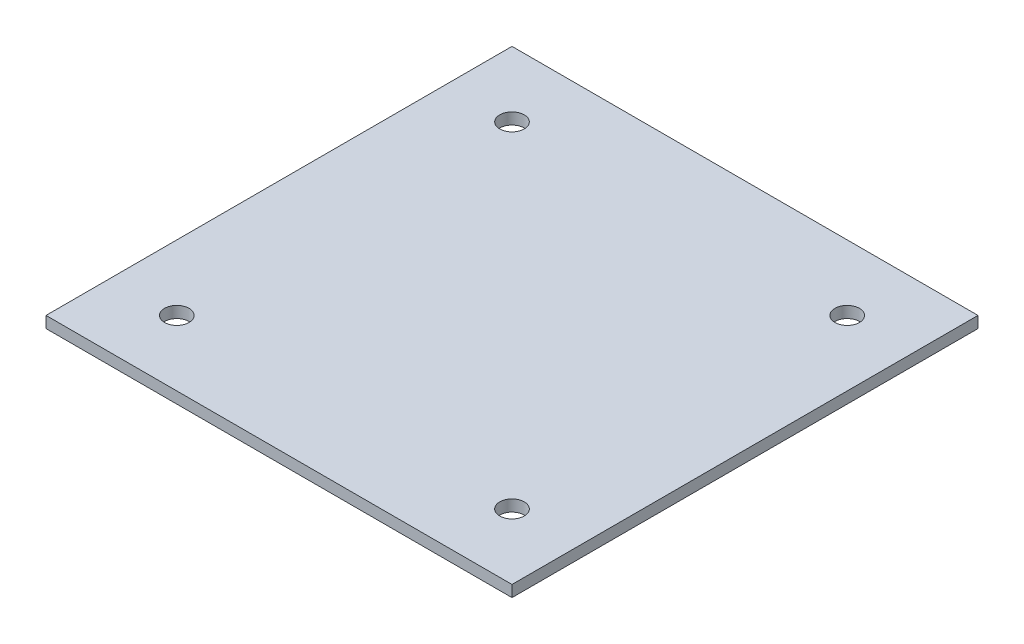
ISO-10303-21;
HEADER;
FILE_DESCRIPTION(('STEP AP214'),'2;1');
FILE_NAME('part.step','',(''),(''),'','','');
FILE_SCHEMA(('AUTOMOTIVE_DESIGN { 1 0 10303 214 1 1 1 1 }'));
ENDSEC;
DATA;
#1=APPLICATION_CONTEXT('core data for automotive mechanical design processes');
#2=APPLICATION_PROTOCOL_DEFINITION('international standard','automotive_design',2000,#1);
#3=PRODUCT_CONTEXT('',#1,'mechanical');
#4=PRODUCT('Part','Part','',(#3));
#5=PRODUCT_RELATED_PRODUCT_CATEGORY('part','',(#4));
#6=PRODUCT_DEFINITION_FORMATION('','',#4);
#7=PRODUCT_DEFINITION_CONTEXT('part definition',#1,'design');
#8=PRODUCT_DEFINITION('design','',#6,#7);
#9=PRODUCT_DEFINITION_SHAPE('','',#8);
#10=(LENGTH_UNIT() NAMED_UNIT(*) SI_UNIT(.MILLI.,.METRE.));
#11=(NAMED_UNIT(*) PLANE_ANGLE_UNIT() SI_UNIT($,.RADIAN.));
#12=(NAMED_UNIT(*) SI_UNIT($,.STERADIAN.) SOLID_ANGLE_UNIT());
#13=UNCERTAINTY_MEASURE_WITH_UNIT(LENGTH_MEASURE(1.E-05),#10,'distance_accuracy_value','');
#14=(GEOMETRIC_REPRESENTATION_CONTEXT(3) GLOBAL_UNCERTAINTY_ASSIGNED_CONTEXT((#13)) GLOBAL_UNIT_ASSIGNED_CONTEXT((#10,
#11,#12)) REPRESENTATION_CONTEXT('',''));
#15=CARTESIAN_POINT('',(0.,0.,0.));
#16=DIRECTION('',(0.,0.,1.));
#17=DIRECTION('',(1.,0.,0.));
#18=AXIS2_PLACEMENT_3D('',#15,#16,#17);
#19=CARTESIAN_POINT('',(0.,1.397,28.5));
#20=DIRECTION('',(0.,0.,-1.));
#21=DIRECTION('',(-1.,0.,0.));
#22=AXIS2_PLACEMENT_3D('',#19,#20,#21);
#23=PLANE('',#22);
#24=DIRECTION('',(1.,0.,0.));
#25=VECTOR('',#24,1.);
#26=CARTESIAN_POINT('',(0.,0.,28.5));
#27=LINE('',#26,#25);
#28=CARTESIAN_POINT('',(-28.5,0.,28.5));
#29=VERTEX_POINT('',#28);
#30=CARTESIAN_POINT('',(28.5,0.,28.5));
#31=VERTEX_POINT('',#30);
#32=EDGE_CURVE('E115',#29,#31,#27,.T.);
#33=ORIENTED_EDGE('',*,*,#32,.T.);
#34=DIRECTION('',(0.,-1.,0.));
#35=VECTOR('',#34,1.);
#36=CARTESIAN_POINT('',(28.5,1.397,28.5));
#37=LINE('',#36,#35);
#38=CARTESIAN_POINT('',(28.5,1.397,28.5));
#39=VERTEX_POINT('',#38);
#40=EDGE_CURVE('E11',#39,#31,#37,.T.);
#41=ORIENTED_EDGE('',*,*,#40,.F.);
#42=DIRECTION('',(1.,0.,0.));
#43=VECTOR('',#42,1.);
#44=CARTESIAN_POINT('',(0.,1.397,28.5));
#45=LINE('',#44,#43);
#46=CARTESIAN_POINT('',(-28.5,1.397,28.5));
#47=VERTEX_POINT('',#46);
#48=EDGE_CURVE('E89',#47,#39,#45,.T.);
#49=ORIENTED_EDGE('',*,*,#48,.F.);
#50=DIRECTION('',(0.,-1.,0.));
#51=VECTOR('',#50,1.);
#52=CARTESIAN_POINT('',(-28.5,1.397,28.5));
#53=LINE('',#52,#51);
#54=EDGE_CURVE('E55',#47,#29,#53,.T.);
#55=ORIENTED_EDGE('',*,*,#54,.T.);
#56=EDGE_LOOP('',(#33,#41,#49,#55));
#57=FACE_BOUND('',#56,.T.);
#58=ADVANCED_FACE('F38',(#57),#23,.F.);
#59=CARTESIAN_POINT('',(28.5,1.397,0.));
#60=DIRECTION('',(-1.,0.,0.));
#61=DIRECTION('',(0.,0.,1.));
#62=AXIS2_PLACEMENT_3D('',#59,#60,#61);
#63=PLANE('',#62);
#64=DIRECTION('',(0.,0.,-1.));
#65=VECTOR('',#64,1.);
#66=CARTESIAN_POINT('',(28.5,0.,0.));
#67=LINE('',#66,#65);
#68=CARTESIAN_POINT('',(28.5,0.,-28.5));
#69=VERTEX_POINT('',#68);
#70=EDGE_CURVE('E94',#31,#69,#67,.T.);
#71=ORIENTED_EDGE('',*,*,#70,.T.);
#72=DIRECTION('',(0.,-1.,0.));
#73=VECTOR('',#72,1.);
#74=CARTESIAN_POINT('',(28.5,1.397,-28.5));
#75=LINE('',#74,#73);
#76=CARTESIAN_POINT('',(28.5,1.397,-28.5));
#77=VERTEX_POINT('',#76);
#78=EDGE_CURVE('E47',#77,#69,#75,.T.);
#79=ORIENTED_EDGE('',*,*,#78,.F.);
#80=DIRECTION('',(0.,0.,-1.));
#81=VECTOR('',#80,1.);
#82=CARTESIAN_POINT('',(28.5,1.397,0.));
#83=LINE('',#82,#81);
#84=EDGE_CURVE('E80',#39,#77,#83,.T.);
#85=ORIENTED_EDGE('',*,*,#84,.F.);
#86=ORIENTED_EDGE('',*,*,#40,.T.);
#87=EDGE_LOOP('',(#71,#79,#85,#86));
#88=FACE_BOUND('',#87,.T.);
#89=ADVANCED_FACE('F93',(#88),#63,.F.);
#90=CARTESIAN_POINT('',(0.,1.397,-28.5));
#91=DIRECTION('',(0.,0.,-1.));
#92=DIRECTION('',(-1.,0.,0.));
#93=AXIS2_PLACEMENT_3D('',#90,#91,#92);
#94=PLANE('',#93);
#95=DIRECTION('',(1.,0.,0.));
#96=VECTOR('',#95,1.);
#97=CARTESIAN_POINT('',(0.,0.,-28.5));
#98=LINE('',#97,#96);
#99=CARTESIAN_POINT('',(-28.5,0.,-28.5));
#100=VERTEX_POINT('',#99);
#101=EDGE_CURVE('E118',#100,#69,#98,.T.);
#102=ORIENTED_EDGE('',*,*,#101,.F.);
#103=DIRECTION('',(0.,-1.,0.));
#104=VECTOR('',#103,1.);
#105=CARTESIAN_POINT('',(-28.5,1.397,-28.5));
#106=LINE('',#105,#104);
#107=CARTESIAN_POINT('',(-28.5,1.397,-28.5));
#108=VERTEX_POINT('',#107);
#109=EDGE_CURVE('E69',#108,#100,#106,.T.);
#110=ORIENTED_EDGE('',*,*,#109,.F.);
#111=DIRECTION('',(1.,0.,0.));
#112=VECTOR('',#111,1.);
#113=CARTESIAN_POINT('',(0.,1.397,-28.5));
#114=LINE('',#113,#112);
#115=EDGE_CURVE('E88',#108,#77,#114,.T.);
#116=ORIENTED_EDGE('',*,*,#115,.T.);
#117=ORIENTED_EDGE('',*,*,#78,.T.);
#118=EDGE_LOOP('',(#102,#110,#116,#117));
#119=FACE_BOUND('',#118,.T.);
#120=ADVANCED_FACE('F97',(#119),#94,.T.);
#121=CARTESIAN_POINT('',(20.5000000000001,1.397,20.4999999999998));
#122=DIRECTION('',(0.,-1.,0.));
#123=DIRECTION('',(0.,0.,-1.));
#124=AXIS2_PLACEMENT_3D('',#121,#122,#123);
#125=CYLINDRICAL_SURFACE('',#124,1.5);
#126=CARTESIAN_POINT('',(20.5000000000001,1.397,20.4999999999998));
#127=DIRECTION('',(0.,1.,0.));
#128=DIRECTION('',(0.,0.,1.));
#129=AXIS2_PLACEMENT_3D('',#126,#127,#128);
#130=CIRCLE('',#129,1.5);
#131=CARTESIAN_POINT('',(20.5000000000001,1.397,21.9999999999998));
#132=VERTEX_POINT('',#131);
#133=EDGE_CURVE('E100',#132,#132,#130,.T.);
#134=ORIENTED_EDGE('',*,*,#133,.T.);
#135=EDGE_LOOP('',(#134));
#136=FACE_BOUND('',#135,.T.);
#137=CARTESIAN_POINT('',(20.5000000000001,0.,20.4999999999998));
#138=DIRECTION('',(0.,1.,0.));
#139=DIRECTION('',(0.,0.,1.));
#140=AXIS2_PLACEMENT_3D('',#137,#138,#139);
#141=CIRCLE('',#140,1.5);
#142=CARTESIAN_POINT('',(20.5000000000001,0.,21.9999999999998));
#143=VERTEX_POINT('',#142);
#144=EDGE_CURVE('E123',#143,#143,#141,.T.);
#145=ORIENTED_EDGE('',*,*,#144,.F.);
#146=EDGE_LOOP('',(#145));
#147=FACE_BOUND('',#146,.T.);
#148=ADVANCED_FACE('F171',(#136,#147),#125,.F.);
#149=CARTESIAN_POINT('',(-28.5,1.397,0.));
#150=DIRECTION('',(-1.,0.,0.));
#151=DIRECTION('',(0.,0.,1.));
#152=AXIS2_PLACEMENT_3D('',#149,#150,#151);
#153=PLANE('',#152);
#154=DIRECTION('',(0.,0.,-1.));
#155=VECTOR('',#154,1.);
#156=CARTESIAN_POINT('',(-28.5,0.,0.));
#157=LINE('',#156,#155);
#158=EDGE_CURVE('E120',#29,#100,#157,.T.);
#159=ORIENTED_EDGE('',*,*,#158,.F.);
#160=ORIENTED_EDGE('',*,*,#54,.F.);
#161=DIRECTION('',(0.,0.,-1.));
#162=VECTOR('',#161,1.);
#163=CARTESIAN_POINT('',(-28.5,1.397,0.));
#164=LINE('',#163,#162);
#165=EDGE_CURVE('E98',#47,#108,#164,.T.);
#166=ORIENTED_EDGE('',*,*,#165,.T.);
#167=ORIENTED_EDGE('',*,*,#109,.T.);
#168=EDGE_LOOP('',(#159,#160,#166,#167));
#169=FACE_BOUND('',#168,.T.);
#170=ADVANCED_FACE('F165',(#169),#153,.T.);
#171=CARTESIAN_POINT('',(-20.5,1.397,-20.5));
#172=DIRECTION('',(0.,-1.,0.));
#173=DIRECTION('',(0.,0.,-1.));
#174=AXIS2_PLACEMENT_3D('',#171,#172,#173);
#175=CYLINDRICAL_SURFACE('',#174,1.5);
#176=CARTESIAN_POINT('',(-20.5,1.397,-20.5));
#177=DIRECTION('',(0.,1.,0.));
#178=DIRECTION('',(0.,0.,1.));
#179=AXIS2_PLACEMENT_3D('',#176,#177,#178);
#180=CIRCLE('',#179,1.5);
#181=CARTESIAN_POINT('',(-20.5,1.397,-19.));
#182=VERTEX_POINT('',#181);
#183=EDGE_CURVE('E134',#182,#182,#180,.T.);
#184=ORIENTED_EDGE('',*,*,#183,.T.);
#185=EDGE_LOOP('',(#184));
#186=FACE_BOUND('',#185,.T.);
#187=CARTESIAN_POINT('',(-20.5,0.,-20.5));
#188=DIRECTION('',(0.,1.,0.));
#189=DIRECTION('',(0.,0.,1.));
#190=AXIS2_PLACEMENT_3D('',#187,#188,#189);
#191=CIRCLE('',#190,1.5);
#192=CARTESIAN_POINT('',(-20.5,0.,-19.));
#193=VERTEX_POINT('',#192);
#194=EDGE_CURVE('E112',#193,#193,#191,.T.);
#195=ORIENTED_EDGE('',*,*,#194,.F.);
#196=EDGE_LOOP('',(#195));
#197=FACE_BOUND('',#196,.T.);
#198=ADVANCED_FACE('F142',(#186,#197),#175,.F.);
#199=CARTESIAN_POINT('',(-20.5,1.397,20.5));
#200=DIRECTION('',(0.,-1.,0.));
#201=DIRECTION('',(0.,0.,-1.));
#202=AXIS2_PLACEMENT_3D('',#199,#200,#201);
#203=CYLINDRICAL_SURFACE('',#202,1.5);
#204=CARTESIAN_POINT('',(-20.5,1.397,20.5));
#205=DIRECTION('',(0.,1.,0.));
#206=DIRECTION('',(0.,0.,1.));
#207=AXIS2_PLACEMENT_3D('',#204,#205,#206);
#208=CIRCLE('',#207,1.5);
#209=CARTESIAN_POINT('',(-20.5,1.397,22.));
#210=VERTEX_POINT('',#209);
#211=EDGE_CURVE('E129',#210,#210,#208,.F.);
#212=ORIENTED_EDGE('',*,*,#211,.F.);
#213=EDGE_LOOP('',(#212));
#214=FACE_BOUND('',#213,.T.);
#215=CARTESIAN_POINT('',(-20.5,0.,20.5));
#216=DIRECTION('',(0.,1.,0.));
#217=DIRECTION('',(0.,0.,1.));
#218=AXIS2_PLACEMENT_3D('',#215,#216,#217);
#219=CIRCLE('',#218,1.5);
#220=CARTESIAN_POINT('',(-20.5,0.,22.));
#221=VERTEX_POINT('',#220);
#222=EDGE_CURVE('E109',#221,#221,#219,.F.);
#223=ORIENTED_EDGE('',*,*,#222,.T.);
#224=EDGE_LOOP('',(#223));
#225=FACE_BOUND('',#224,.T.);
#226=ADVANCED_FACE('F40',(#214,#225),#203,.F.);
#227=CARTESIAN_POINT('',(20.4999999999999,1.397,-20.5));
#228=DIRECTION('',(0.,-1.,0.));
#229=DIRECTION('',(0.,0.,-1.));
#230=AXIS2_PLACEMENT_3D('',#227,#228,#229);
#231=CYLINDRICAL_SURFACE('',#230,1.5);
#232=CARTESIAN_POINT('',(20.4999999999999,1.397,-20.5));
#233=DIRECTION('',(0.,1.,0.));
#234=DIRECTION('',(0.,0.,1.));
#235=AXIS2_PLACEMENT_3D('',#232,#233,#234);
#236=CIRCLE('',#235,1.5);
#237=CARTESIAN_POINT('',(20.4999999999999,1.397,-19.));
#238=VERTEX_POINT('',#237);
#239=EDGE_CURVE('E106',#238,#238,#236,.F.);
#240=ORIENTED_EDGE('',*,*,#239,.F.);
#241=EDGE_LOOP('',(#240));
#242=FACE_BOUND('',#241,.T.);
#243=CARTESIAN_POINT('',(20.4999999999999,0.,-20.5));
#244=DIRECTION('',(0.,1.,0.));
#245=DIRECTION('',(0.,0.,1.));
#246=AXIS2_PLACEMENT_3D('',#243,#244,#245);
#247=CIRCLE('',#246,1.5);
#248=CARTESIAN_POINT('',(20.4999999999999,0.,-19.));
#249=VERTEX_POINT('',#248);
#250=EDGE_CURVE('E126',#249,#249,#247,.F.);
#251=ORIENTED_EDGE('',*,*,#250,.T.);
#252=EDGE_LOOP('',(#251));
#253=FACE_BOUND('',#252,.T.);
#254=ADVANCED_FACE('F147',(#242,#253),#231,.F.);
#255=CARTESIAN_POINT('',(0.,1.397,0.));
#256=DIRECTION('',(0.,1.,0.));
#257=DIRECTION('',(0.,0.,1.));
#258=AXIS2_PLACEMENT_3D('',#255,#256,#257);
#259=PLANE('',#258);
#260=ORIENTED_EDGE('',*,*,#211,.T.);
#261=EDGE_LOOP('',(#260));
#262=FACE_BOUND('',#261,.T.);
#263=ORIENTED_EDGE('',*,*,#183,.F.);
#264=EDGE_LOOP('',(#263));
#265=FACE_BOUND('',#264,.T.);
#266=ORIENTED_EDGE('',*,*,#48,.T.);
#267=ORIENTED_EDGE('',*,*,#84,.T.);
#268=ORIENTED_EDGE('',*,*,#115,.F.);
#269=ORIENTED_EDGE('',*,*,#165,.F.);
#270=EDGE_LOOP('',(#266,#267,#268,#269));
#271=FACE_BOUND('',#270,.T.);
#272=ORIENTED_EDGE('',*,*,#133,.F.);
#273=EDGE_LOOP('',(#272));
#274=FACE_BOUND('',#273,.T.);
#275=ORIENTED_EDGE('',*,*,#239,.T.);
#276=EDGE_LOOP('',(#275));
#277=FACE_BOUND('',#276,.T.);
#278=ADVANCED_FACE('F84',(#262,#265,#271,#274,#277),#259,.T.);
#279=CARTESIAN_POINT('',(0.,0.,0.));
#280=DIRECTION('',(0.,1.,0.));
#281=DIRECTION('',(0.,0.,1.));
#282=AXIS2_PLACEMENT_3D('',#279,#280,#281);
#283=PLANE('',#282);
#284=ORIENTED_EDGE('',*,*,#222,.F.);
#285=EDGE_LOOP('',(#284));
#286=FACE_BOUND('',#285,.T.);
#287=ORIENTED_EDGE('',*,*,#194,.T.);
#288=EDGE_LOOP('',(#287));
#289=FACE_BOUND('',#288,.T.);
#290=ORIENTED_EDGE('',*,*,#32,.F.);
#291=ORIENTED_EDGE('',*,*,#158,.T.);
#292=ORIENTED_EDGE('',*,*,#101,.T.);
#293=ORIENTED_EDGE('',*,*,#70,.F.);
#294=EDGE_LOOP('',(#290,#291,#292,#293));
#295=FACE_BOUND('',#294,.T.);
#296=ORIENTED_EDGE('',*,*,#144,.T.);
#297=EDGE_LOOP('',(#296));
#298=FACE_BOUND('',#297,.T.);
#299=ORIENTED_EDGE('',*,*,#250,.F.);
#300=EDGE_LOOP('',(#299));
#301=FACE_BOUND('',#300,.T.);
#302=ADVANCED_FACE('F146',(#286,#289,#295,#298,#301),#283,.F.);
#303=CLOSED_SHELL('',(#58,#89,#120,#148,#170,#198,#226,#254,#278,#302));
#304=MANIFOLD_SOLID_BREP('B2',#303);
#305=ADVANCED_BREP_SHAPE_REPRESENTATION('',(#18,#304),#14);
#306=SHAPE_DEFINITION_REPRESENTATION(#9,#305);
ENDSEC;
END-ISO-10303-21;
